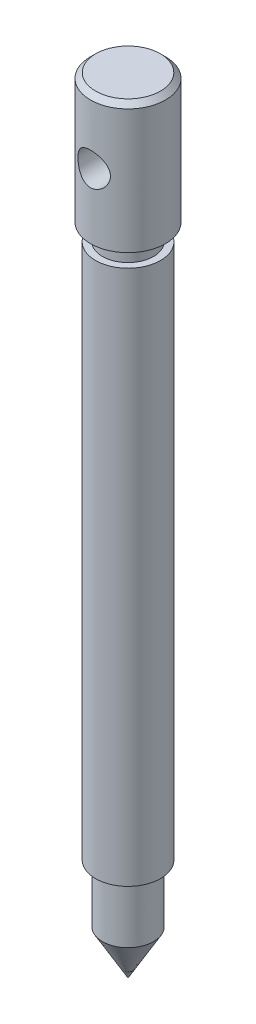
ISO-10303-21;
HEADER;
FILE_DESCRIPTION(('STEP AP214'),'2;1');
FILE_NAME('part.step','',(''),(''),'','','');
FILE_SCHEMA(('AUTOMOTIVE_DESIGN { 1 0 10303 214 1 1 1 1 }'));
ENDSEC;
DATA;
#1=APPLICATION_CONTEXT('core data for automotive mechanical design processes');
#2=APPLICATION_PROTOCOL_DEFINITION('international standard','automotive_design',2000,#1);
#3=PRODUCT_CONTEXT('',#1,'mechanical');
#4=PRODUCT('Part','Part','',(#3));
#5=PRODUCT_RELATED_PRODUCT_CATEGORY('part','',(#4));
#6=PRODUCT_DEFINITION_FORMATION('','',#4);
#7=PRODUCT_DEFINITION_CONTEXT('part definition',#1,'design');
#8=PRODUCT_DEFINITION('design','',#6,#7);
#9=PRODUCT_DEFINITION_SHAPE('','',#8);
#10=(LENGTH_UNIT() NAMED_UNIT(*) SI_UNIT(.MILLI.,.METRE.));
#11=(NAMED_UNIT(*) PLANE_ANGLE_UNIT() SI_UNIT($,.RADIAN.));
#12=(NAMED_UNIT(*) SI_UNIT($,.STERADIAN.) SOLID_ANGLE_UNIT());
#13=UNCERTAINTY_MEASURE_WITH_UNIT(LENGTH_MEASURE(1.E-05),#10,'distance_accuracy_value','');
#14=(GEOMETRIC_REPRESENTATION_CONTEXT(3) GLOBAL_UNCERTAINTY_ASSIGNED_CONTEXT((#13)) GLOBAL_UNIT_ASSIGNED_CONTEXT((#10,
#11,#12)) REPRESENTATION_CONTEXT('',''));
#15=CARTESIAN_POINT('',(0.,0.,0.));
#16=DIRECTION('',(0.,0.,1.));
#17=DIRECTION('',(1.,0.,0.));
#18=AXIS2_PLACEMENT_3D('',#15,#16,#17);
#19=CARTESIAN_POINT('',(0.,0.,0.));
#20=DIRECTION('',(0.,1.,0.));
#21=DIRECTION('',(0.,0.,1.));
#22=AXIS2_PLACEMENT_3D('',#19,#20,#21);
#23=CONICAL_SURFACE('',#22,0.,0.5235987755983);
#24=CARTESIAN_POINT('',(0.,12.9903810567665,0.));
#25=DIRECTION('',(0.,-1.,0.));
#26=DIRECTION('',(0.,0.,-1.));
#27=AXIS2_PLACEMENT_3D('',#24,#25,#26);
#28=CIRCLE('',#27,7.5);
#29=CARTESIAN_POINT('',(0.,12.9903810567665,-7.5));
#30=VERTEX_POINT('',#29);
#31=EDGE_CURVE('E116',#30,#30,#28,.T.);
#32=ORIENTED_EDGE('',*,*,#31,.T.);
#33=EDGE_LOOP('',(#32));
#34=FACE_BOUND('',#33,.T.);
#35=CARTESIAN_POINT('',(0.,0.,0.));
#36=VERTEX_POINT('',#35);
#37=VERTEX_LOOP('',#36);
#38=FACE_BOUND('',#37,.T.);
#39=ADVANCED_FACE('F40',(#34,#38),#23,.T.);
#40=CARTESIAN_POINT('',(0.,0.,0.));
#41=DIRECTION('',(0.,-1.,0.));
#42=DIRECTION('',(0.,0.,-1.));
#43=AXIS2_PLACEMENT_3D('',#40,#41,#42);
#44=CYLINDRICAL_SURFACE('',#43,7.5);
#45=CARTESIAN_POINT('',(0.,30.,0.));
#46=DIRECTION('',(0.,-1.,0.));
#47=DIRECTION('',(0.,0.,-1.));
#48=AXIS2_PLACEMENT_3D('',#45,#46,#47);
#49=CIRCLE('',#48,7.5);
#50=CARTESIAN_POINT('',(0.,30.,-7.5));
#51=VERTEX_POINT('',#50);
#52=EDGE_CURVE('E117',#51,#51,#49,.T.);
#53=ORIENTED_EDGE('',*,*,#52,.T.);
#54=EDGE_LOOP('',(#53));
#55=FACE_BOUND('',#54,.T.);
#56=ORIENTED_EDGE('',*,*,#31,.F.);
#57=EDGE_LOOP('',(#56));
#58=FACE_BOUND('',#57,.T.);
#59=ADVANCED_FACE('F51',(#55,#58),#44,.T.);
#60=CARTESIAN_POINT('',(7.5,30.,0.));
#61=DIRECTION('',(0.,-1.,0.));
#62=DIRECTION('',(0.,0.,-1.));
#63=AXIS2_PLACEMENT_3D('',#60,#61,#62);
#64=PLANE('',#63);
#65=CARTESIAN_POINT('',(0.,30.,0.));
#66=DIRECTION('',(0.,-1.,0.));
#67=DIRECTION('',(0.,0.,-1.));
#68=AXIS2_PLACEMENT_3D('',#65,#66,#67);
#69=CIRCLE('',#68,9.525);
#70=CARTESIAN_POINT('',(0.,30.,-9.525));
#71=VERTEX_POINT('',#70);
#72=EDGE_CURVE('E120',#71,#71,#69,.T.);
#73=ORIENTED_EDGE('',*,*,#72,.T.);
#74=EDGE_LOOP('',(#73));
#75=FACE_BOUND('',#74,.T.);
#76=ORIENTED_EDGE('',*,*,#52,.F.);
#77=EDGE_LOOP('',(#76));
#78=FACE_BOUND('',#77,.T.);
#79=ADVANCED_FACE('F56',(#75,#78),#64,.T.);
#80=CARTESIAN_POINT('',(0.,0.,0.));
#81=DIRECTION('',(0.,-1.,0.));
#82=DIRECTION('',(0.,0.,-1.));
#83=AXIS2_PLACEMENT_3D('',#80,#81,#82);
#84=CYLINDRICAL_SURFACE('',#83,9.525);
#85=CARTESIAN_POINT('',(0.,187.,0.));
#86=DIRECTION('',(0.,-1.,0.));
#87=DIRECTION('',(0.,0.,-1.));
#88=AXIS2_PLACEMENT_3D('',#85,#86,#87);
#89=CIRCLE('',#88,9.525);
#90=CARTESIAN_POINT('',(0.,187.,-9.525));
#91=VERTEX_POINT('',#90);
#92=EDGE_CURVE('E125',#91,#91,#89,.T.);
#93=ORIENTED_EDGE('',*,*,#92,.T.);
#94=EDGE_LOOP('',(#93));
#95=FACE_BOUND('',#94,.T.);
#96=ORIENTED_EDGE('',*,*,#72,.F.);
#97=EDGE_LOOP('',(#96));
#98=FACE_BOUND('',#97,.T.);
#99=ADVANCED_FACE('F63',(#95,#98),#84,.T.);
#100=CARTESIAN_POINT('',(9.525,187.,0.));
#101=DIRECTION('',(0.,1.,0.));
#102=DIRECTION('',(0.,0.,1.));
#103=AXIS2_PLACEMENT_3D('',#100,#101,#102);
#104=PLANE('',#103);
#105=CARTESIAN_POINT('',(0.,187.,0.));
#106=DIRECTION('',(0.,-1.,0.));
#107=DIRECTION('',(0.,0.,-1.));
#108=AXIS2_PLACEMENT_3D('',#105,#106,#107);
#109=CIRCLE('',#108,7.5);
#110=CARTESIAN_POINT('',(0.,187.,-7.5));
#111=VERTEX_POINT('',#110);
#112=EDGE_CURVE('E128',#111,#111,#109,.T.);
#113=ORIENTED_EDGE('',*,*,#112,.T.);
#114=EDGE_LOOP('',(#113));
#115=FACE_BOUND('',#114,.T.);
#116=ORIENTED_EDGE('',*,*,#92,.F.);
#117=EDGE_LOOP('',(#116));
#118=FACE_BOUND('',#117,.T.);
#119=ADVANCED_FACE('F67',(#115,#118),#104,.T.);
#120=CARTESIAN_POINT('',(0.,0.,0.));
#121=DIRECTION('',(0.,-1.,0.));
#122=DIRECTION('',(0.,0.,-1.));
#123=AXIS2_PLACEMENT_3D('',#120,#121,#122);
#124=CYLINDRICAL_SURFACE('',#123,7.5);
#125=CARTESIAN_POINT('',(0.,192.,0.));
#126=DIRECTION('',(0.,-1.,0.));
#127=DIRECTION('',(0.,0.,-1.));
#128=AXIS2_PLACEMENT_3D('',#125,#126,#127);
#129=CIRCLE('',#128,7.5);
#130=CARTESIAN_POINT('',(0.,192.,-7.5));
#131=VERTEX_POINT('',#130);
#132=EDGE_CURVE('E131',#131,#131,#129,.T.);
#133=ORIENTED_EDGE('',*,*,#132,.T.);
#134=EDGE_LOOP('',(#133));
#135=FACE_BOUND('',#134,.T.);
#136=ORIENTED_EDGE('',*,*,#112,.F.);
#137=EDGE_LOOP('',(#136));
#138=FACE_BOUND('',#137,.T.);
#139=ADVANCED_FACE('F71',(#135,#138),#124,.T.);
#140=CARTESIAN_POINT('',(7.5,192.,0.));
#141=DIRECTION('',(0.,-1.,0.));
#142=DIRECTION('',(0.,0.,-1.));
#143=AXIS2_PLACEMENT_3D('',#140,#141,#142);
#144=PLANE('',#143);
#145=CARTESIAN_POINT('',(0.,192.,0.));
#146=DIRECTION('',(0.,-1.,0.));
#147=DIRECTION('',(0.,0.,-1.));
#148=AXIS2_PLACEMENT_3D('',#145,#146,#147);
#149=CIRCLE('',#148,11.);
#150=CARTESIAN_POINT('',(0.,192.,-11.));
#151=VERTEX_POINT('',#150);
#152=EDGE_CURVE('E134',#151,#151,#149,.T.);
#153=ORIENTED_EDGE('',*,*,#152,.T.);
#154=EDGE_LOOP('',(#153));
#155=FACE_BOUND('',#154,.T.);
#156=ORIENTED_EDGE('',*,*,#132,.F.);
#157=EDGE_LOOP('',(#156));
#158=FACE_BOUND('',#157,.T.);
#159=ADVANCED_FACE('F75',(#155,#158),#144,.T.);
#160=CARTESIAN_POINT('',(0.,0.,0.));
#161=DIRECTION('',(0.,-1.,0.));
#162=DIRECTION('',(0.,0.,-1.));
#163=AXIS2_PLACEMENT_3D('',#160,#161,#162);
#164=CYLINDRICAL_SURFACE('',#163,11.);
#165=CARTESIAN_POINT('',(0.,228.5,0.));
#166=DIRECTION('',(0.,1.,0.));
#167=DIRECTION('',(0.,0.,1.));
#168=AXIS2_PLACEMENT_3D('',#165,#166,#167);
#169=CIRCLE('',#168,11.);
#170=CARTESIAN_POINT('',(0.,228.5,11.));
#171=VERTEX_POINT('',#170);
#172=EDGE_CURVE('E47',#171,#171,#169,.F.);
#173=ORIENTED_EDGE('',*,*,#172,.T.);
#174=EDGE_LOOP('',(#173));
#175=FACE_BOUND('',#174,.T.);
#176=CARTESIAN_POINT('',(0.,215.7625,-11.));
#177=CARTESIAN_POINT('',(0.127169608569886,215.76249906358,-10.9999992315258));
#178=CARTESIAN_POINT('',(0.254376099032909,215.757399640568,-10.9977887979623));
#179=CARTESIAN_POINT('',(0.507877519838304,215.737051077353,-10.9890019964665));
#180=CARTESIAN_POINT('',(0.634171860265323,215.721795875995,-10.9824230213147));
#181=CARTESIAN_POINT('',(0.885103951344808,215.68125820564,-10.9650552186148));
#182=CARTESIAN_POINT('',(1.00973798351956,215.655956204877,-10.9542581915066));
#183=CARTESIAN_POINT('',(1.25625104019601,215.595579816268,-10.9287327775452));
#184=CARTESIAN_POINT('',(1.37812891647932,215.5605014338,-10.9140027837875));
#185=CARTESIAN_POINT('',(1.6177993403371,215.481071392477,-10.8810520259155));
#186=CARTESIAN_POINT('',(1.73560608359136,215.436756788804,-10.8628452342524));
#187=CARTESIAN_POINT('',(1.9669295951166,215.339167924001,-10.8233538234563));
#188=CARTESIAN_POINT('',(2.08044473804369,215.285890309156,-10.8020680526726));
#189=CARTESIAN_POINT('',(2.41339731451278,215.1133055029,-10.7343665482442));
#190=CARTESIAN_POINT('',(2.62555202215799,214.981142674763,-10.6840619916617));
#191=CARTESIAN_POINT('',(3.03538555572489,214.679116500169,-10.5751454503608));
#192=CARTESIAN_POINT('',(3.23185415570827,214.507729115361,-10.5162479987283));
#193=CARTESIAN_POINT('',(3.59441438843805,214.135137936174,-10.3979112663786));
#194=CARTESIAN_POINT('',(3.76048882190558,213.933917375819,-10.3384716987399));
#195=CARTESIAN_POINT('',(3.98773192471391,213.607360031775,-10.2520765225787));
#196=CARTESIAN_POINT('',(4.06139965464039,213.491073806929,-10.2230387460115));
#197=CARTESIAN_POINT('',(4.19860595213083,213.252124733832,-10.1674567699124));
#198=CARTESIAN_POINT('',(4.26214873500453,213.129464567592,-10.1409115345635));
#199=CARTESIAN_POINT('',(4.37855231030782,212.878516276464,-10.0911987226593));
#200=CARTESIAN_POINT('',(4.43141288364232,212.750228036208,-10.0680312153849));
#201=CARTESIAN_POINT('',(4.52588798261691,212.488967265612,-10.0259171570631));
#202=CARTESIAN_POINT('',(4.56750844356246,212.355997249567,-10.006968379261));
#203=CARTESIAN_POINT('',(4.63724136886323,212.093136288234,-9.97483796269579));
#204=CARTESIAN_POINT('',(4.66592847277802,211.963427434568,-9.96141397564219));
#205=CARTESIAN_POINT('',(4.71239388300809,211.701713639886,-9.93951740448613));
#206=CARTESIAN_POINT('',(4.73017735239497,211.569709816078,-9.93104247700348));
#207=CARTESIAN_POINT('',(4.75462155816268,211.304483885469,-9.91936279910202));
#208=CARTESIAN_POINT('',(4.76128573347991,211.171262168154,-9.91615641924989));
#209=CARTESIAN_POINT('',(4.76341126030826,210.904712675175,-9.91513570160027));
#210=CARTESIAN_POINT('',(4.75887327481019,210.771384906253,-9.91732104469803));
#211=CARTESIAN_POINT('',(4.73951259242362,210.516985738606,-9.92658652977835));
#212=CARTESIAN_POINT('',(4.7255894914725,210.395828940204,-9.93323834547099));
#213=CARTESIAN_POINT('',(4.68855464390079,210.155200666476,-9.95077257291799));
#214=CARTESIAN_POINT('',(4.66543991329525,210.035729751513,-9.96165635852017));
#215=CARTESIAN_POINT('',(4.61026155033725,209.799325131379,-9.98731259624197));
#216=CARTESIAN_POINT('',(4.57819982754518,209.682390890538,-10.0020842185408));
#217=CARTESIAN_POINT('',(4.50543088174325,209.4517273684,-10.0350725941026));
#218=CARTESIAN_POINT('',(4.46472031412644,209.337999346312,-10.053290679853));
#219=CARTESIAN_POINT('',(4.32816308811113,208.997781256512,-10.1132126623459));
#220=CARTESIAN_POINT('',(4.21906570317983,208.777270793995,-10.1596087144542));
#221=CARTESIAN_POINT('',(3.96930021580578,208.356900532365,-10.2597610976456));
#222=CARTESIAN_POINT('',(3.82861914414851,208.157049265917,-10.3135204487752));
#223=CARTESIAN_POINT('',(3.50451218310632,207.764191982272,-10.4283553388267));
#224=CARTESIAN_POINT('',(3.31834550544064,207.573504657207,-10.4896491019545));
#225=CARTESIAN_POINT('',(2.91597767577435,207.225187168127,-10.6085312555589));
#226=CARTESIAN_POINT('',(2.69976836118786,207.067566017503,-10.6661186327673));
#227=CARTESIAN_POINT('',(2.35378132088765,206.857531224599,-10.745898239449));
#228=CARTESIAN_POINT('',(2.23306896826151,206.79121751829,-10.7716900453297));
#229=CARTESIAN_POINT('',(1.98583652535034,206.66908333842,-10.8199943833085));
#230=CARTESIAN_POINT('',(1.85931883864791,206.613258570037,-10.8425082567418));
#231=CARTESIAN_POINT('',(1.60138370060539,206.512668918535,-10.8835944302055));
#232=CARTESIAN_POINT('',(1.46996754890906,206.46790112552,-10.9021677670965));
#233=CARTESIAN_POINT('',(1.20320977582517,206.389902858659,-10.9348220206971));
#234=CARTESIAN_POINT('',(1.06786848081681,206.356671428518,-10.9489033097628));
#235=CARTESIAN_POINT('',(0.803581231435723,206.303982324917,-10.9713558192959));
#236=CARTESIAN_POINT('',(0.674816626566859,206.283749172739,-10.9800471470545));
#237=CARTESIAN_POINT('',(0.415841013177591,206.253899591273,-10.9929013558986));
#238=CARTESIAN_POINT('',(0.285630092490738,206.244282520802,-10.9970645104739));
#239=CARTESIAN_POINT('',(0.0248272915592043,206.235778340005,-11.0007448398786));
#240=CARTESIAN_POINT('',(-0.105764478696193,206.236888389513,-11.0002632444747));
#241=CARTESIAN_POINT('',(-0.366312844548624,206.249817333486,-10.9946712405559));
#242=CARTESIAN_POINT('',(-0.496269456325476,206.261635953719,-10.9895609505752));
#243=CARTESIAN_POINT('',(-0.747450880927748,206.294909375211,-10.9752566106535));
#244=CARTESIAN_POINT('',(-0.868764102233973,206.315800960967,-10.9663015531487));
#245=CARTESIAN_POINT('',(-1.10910083512388,206.366813391515,-10.9446101191729));
#246=CARTESIAN_POINT('',(-1.22812359143713,206.396937226999,-10.9318725174273));
#247=CARTESIAN_POINT('',(-1.58051121486539,206.500752941166,-10.8884240877717));
#248=CARTESIAN_POINT('',(-1.80941741851065,206.587918913178,-10.8524641912048));
#249=CARTESIAN_POINT('',(-2.25638154321797,206.798430944382,-10.7685750393689));
#250=CARTESIAN_POINT('',(-2.47387695984791,206.922822452553,-10.7203068763558));
#251=CARTESIAN_POINT('',(-2.88572938264203,207.203154125147,-10.6168583495153));
#252=CARTESIAN_POINT('',(-3.08007638864383,207.359107846553,-10.5616750192937));
#253=CARTESIAN_POINT('',(-3.45577228054621,207.71206266743,-10.4450595716121));
#254=CARTESIAN_POINT('',(-3.63497567959804,207.91129672231,-10.38347307997));
#255=CARTESIAN_POINT('',(-3.95813548813751,208.338026123447,-10.2646421582828));
#256=CARTESIAN_POINT('',(-4.102081386693,208.565529867043,-10.2073990265779));
#257=CARTESIAN_POINT('',(-4.28946432031643,208.92616085623,-10.129422227521));
#258=CARTESIAN_POINT('',(-4.34760266803679,209.050951378511,-10.1045365350345));
#259=CARTESIAN_POINT('',(-4.45304833016758,209.305675591902,-10.0585123913928));
#260=CARTESIAN_POINT('',(-4.50036039876639,209.435606995962,-10.0373722963421));
#261=CARTESIAN_POINT('',(-4.58362110322574,209.699623367584,-9.99962548445617));
#262=CARTESIAN_POINT('',(-4.61957578853797,209.83370608204,-9.98301635487078));
#263=CARTESIAN_POINT('',(-4.67971248184046,210.105016967582,-9.95496843968551));
#264=CARTESIAN_POINT('',(-4.70389572486276,210.242244807106,-9.94352911169122));
#265=CARTESIAN_POINT('',(-4.73867912924932,210.507341644231,-9.92699638023366));
#266=CARTESIAN_POINT('',(-4.7502274956547,210.635059430707,-9.92146092316295));
#267=CARTESIAN_POINT('',(-4.76298043516609,210.891126401806,-9.91534514228228));
#268=CARTESIAN_POINT('',(-4.76418560753702,211.01947554942,-9.914764531398));
#269=CARTESIAN_POINT('',(-4.7562378994933,211.275755287343,-9.91857951964499));
#270=CARTESIAN_POINT('',(-4.747086721891,211.403685942994,-9.92297430071211));
#271=CARTESIAN_POINT('',(-4.71854371880235,211.658135774711,-9.93657857350089));
#272=CARTESIAN_POINT('',(-4.69915201806896,211.784654967954,-9.94578800656908));
#273=CARTESIAN_POINT('',(-4.65168599467941,212.028492079204,-9.96807226381834));
#274=CARTESIAN_POINT('',(-4.62414281290255,212.145935528524,-9.980908916619));
#275=CARTESIAN_POINT('',(-4.56037765864665,212.377991712753,-10.0102037013579));
#276=CARTESIAN_POINT('',(-4.5241528986952,212.492603525419,-10.0266629963116));
#277=CARTESIAN_POINT('',(-4.4029195141831,212.831139495542,-10.0807832115285));
#278=CARTESIAN_POINT('',(-4.30531894674098,213.0499307061,-10.1232027233425));
#279=CARTESIAN_POINT('',(-4.07240934131555,213.482124603703,-10.2192090386332));
#280=CARTESIAN_POINT('',(-3.93512244119893,213.694332855319,-10.2733286332994));
#281=CARTESIAN_POINT('',(-3.62939952395762,214.093899386246,-10.3852775021215));
#282=CARTESIAN_POINT('',(-3.46095138034861,214.281247942428,-10.4431082147276));
#283=CARTESIAN_POINT('',(-3.08131784371245,214.641521366636,-10.5616275712393));
#284=CARTESIAN_POINT('',(-2.86777252134213,214.812038833894,-10.6221668409421));
#285=CARTESIAN_POINT('',(-2.5269588552426,215.039135771681,-10.7064602814345));
#286=CARTESIAN_POINT('',(-2.40983395952608,215.110101232699,-10.7334916549212));
#287=CARTESIAN_POINT('',(-2.16943232027393,215.241901243757,-10.7846476785177));
#288=CARTESIAN_POINT('',(-2.04615845217077,215.302740472441,-10.808773669575));
#289=CARTESIAN_POINT('',(-1.79593191221221,215.412990692063,-10.8531363171421));
#290=CARTESIAN_POINT('',(-1.66904945502341,215.462542183187,-10.8734201912986));
#291=CARTESIAN_POINT('',(-1.41102748206951,215.550712005617,-10.9099020088076));
#292=CARTESIAN_POINT('',(-1.27989003699256,215.589335568618,-10.9261019069378));
#293=CARTESIAN_POINT('',(-1.01464903505411,215.65516093143,-10.9539138731095));
#294=CARTESIAN_POINT('',(-0.880553512995684,215.682390422564,-10.9655370599484));
#295=CARTESIAN_POINT('',(-0.61025480328946,215.725219028798,-10.9838932423328));
#296=CARTESIAN_POINT('',(-0.47405318503904,215.740826414756,-10.9906297154147));
#297=CARTESIAN_POINT('',(-0.281275816418197,215.754520096025,-10.9965470285504));
#298=CARTESIAN_POINT('',(-0.225073005203623,215.757511554191,-10.9978410115761));
#299=CARTESIAN_POINT('',(-0.112582538899644,215.761501721014,-10.9995676706652));
#300=CARTESIAN_POINT('',(-0.0562948831688689,215.76250041453,-11.0000003401848));
#301=CARTESIAN_POINT('',(0.,215.7625,-11.));
#302=B_SPLINE_CURVE_WITH_KNOTS('',3,(#176,#177,#178,#179,#180,#181,#182,#183,#184,#185,#186,
#187,#188,#189,#190,#191,#192,#193,#194,#195,#196,#197,#198,#199,#200,#201,#202,#203,#204,#205,
#206,#207,#208,#209,#210,#211,#212,#213,#214,#215,#216,#217,#218,#219,#220,#221,#222,#223,#224,
#225,#226,#227,#228,#229,#230,#231,#232,#233,#234,#235,#236,#237,#238,#239,#240,#241,#242,#243,
#244,#245,#246,#247,#248,#249,#250,#251,#252,#253,#254,#255,#256,#257,#258,#259,#260,#261,#262,
#263,#264,#265,#266,#267,#268,#269,#270,#271,#272,#273,#274,#275,#276,#277,#278,#279,#280,#281,
#282,#283,#284,#285,#286,#287,#288,#289,#290,#291,#292,#293,#294,#295,#296,#297,#298,#299,#300,
#301),.UNSPECIFIED.,.T.,.F.,(4,2,2,2,2,2,2,2,2,2,2,2,2,2,2,2,2,2,2,2,2,2,2,2,2,2,2,2,2,2,2,2,2,
2,2,2,2,2,2,2,2,2,2,2,2,2,2,2,2,2,2,2,2,2,2,2,2,2,2,2,2,2,4),(0.,0.381451993312566,
0.763131848480378,1.14555738090914,1.52813940185813,1.90921509408775,2.29043369289587,
3.05189233337129,3.85047918073446,4.6495165400021,5.0711353785212,5.49257822362285,
5.91402971175716,6.3352582166968,6.73527674070891,7.13510570200879,7.53481098266858,
7.93449260766186,8.30046857049714,8.66656344146164,9.03258023632269,9.39873883254178,
10.1464224984416,10.8944137491951,11.7111753916341,12.528159383758,12.948067035673,
13.3678023748536,13.7874271330941,14.2070170986357,14.5984128683592,14.9897849975058,
15.3810535079037,15.7723119987566,16.1421416584263,16.5120912474506,17.2513254118823,
18.0136593034863,18.7763213395722,19.5975722987525,20.4190677912998,20.8383018150984,
21.2573513841204,21.6761773706982,22.0949594055616,22.4795318284046,22.8640819697052,
23.2485688916662,23.6330511298067,23.9965669860954,24.3601997164309,25.086959527732,
25.8592083753607,26.6317583803871,27.4670553922968,27.8853900054282,28.3035307947201,
28.7161415629878,29.1285544602966,29.539959154772,29.9510707929845,30.1199290012518,
30.2887884924428),.UNSPECIFIED.);
#303=CARTESIAN_POINT('',(0.,215.7625,-11.));
#304=VERTEX_POINT('',#303);
#305=EDGE_CURVE('E95',#304,#304,#302,.T.);
#306=ORIENTED_EDGE('',*,*,#305,.F.);
#307=EDGE_LOOP('',(#306));
#308=FACE_BOUND('',#307,.T.);
#309=CARTESIAN_POINT('',(4.7625,211.,9.91557329406626));
#310=CARTESIAN_POINT('',(4.76249902410094,211.126539320261,9.91557435345229));
#311=CARTESIAN_POINT('',(4.75744952467893,211.253117634035,9.91800397108076));
#312=CARTESIAN_POINT('',(4.73730484479164,211.505344282799,9.92764138162707));
#313=CARTESIAN_POINT('',(4.72220344162109,211.630991992944,9.9348521343312));
#314=CARTESIAN_POINT('',(4.68208700456845,211.880611876832,9.953821054238));
#315=CARTESIAN_POINT('',(4.65705181419024,212.004580110577,9.96558846611061));
#316=CARTESIAN_POINT('',(4.59733385265195,212.24974261166,9.99327788277881));
#317=CARTESIAN_POINT('',(4.56264700161107,212.370935682402,10.00920164434));
#318=CARTESIAN_POINT('',(4.48416064598052,212.609147670442,10.0446077558123));
#319=CARTESIAN_POINT('',(4.44040527614035,212.726183702001,10.0640728168151));
#320=CARTESIAN_POINT('',(4.34406978483923,212.956019839146,10.1060287670711));
#321=CARTESIAN_POINT('',(4.29148634790275,213.06881833373,10.1285207925014));
#322=CARTESIAN_POINT('',(4.12115026636219,213.399787624707,10.1995711578437));
#323=CARTESIAN_POINT('',(3.99071684936783,213.610818040526,10.2517487333394));
#324=CARTESIAN_POINT('',(3.69060949420535,214.021507633518,10.3637142299029));
#325=CARTESIAN_POINT('',(3.51902553880382,214.219685232665,10.4237723191308));
#326=CARTESIAN_POINT('',(3.14527813203637,214.585656896107,10.5425591787687));
#327=CARTESIAN_POINT('',(2.94310238997162,214.75343868864,10.6012874039341));
#328=CARTESIAN_POINT('',(2.61528215786563,214.982546937547,10.6852196552555));
#329=CARTESIAN_POINT('',(2.49897555422024,215.056549823639,10.7130827862208));
#330=CARTESIAN_POINT('',(2.25992323732976,215.194420259555,10.7660438794003));
#331=CARTESIAN_POINT('',(2.13718020348916,215.258291982979,10.7911429789663));
#332=CARTESIAN_POINT('',(1.88604340326822,215.375322371128,10.8378577336395));
#333=CARTESIAN_POINT('',(1.75764922629994,215.42848025586,10.8594731351025));
#334=CARTESIAN_POINT('',(1.49620206190936,215.523507054527,10.8985702467671));
#335=CARTESIAN_POINT('',(1.36315148997336,215.565381726311,10.9160540647633));
#336=CARTESIAN_POINT('',(1.10084698144195,215.635400618558,10.9455279314901));
#337=CARTESIAN_POINT('',(0.971789341643374,215.664175551036,10.9577681129929));
#338=CARTESIAN_POINT('',(0.711441991018879,215.710916837131,10.977744926092));
#339=CARTESIAN_POINT('',(0.580153319236584,215.7288880877,10.9854835980224));
#340=CARTESIAN_POINT('',(0.316363659289761,215.753826835169,10.9962419328216));
#341=CARTESIAN_POINT('',(0.183862873326452,215.760796134888,10.9992623688369));
#342=CARTESIAN_POINT('',(-0.081277852896825,215.763651424616,11.0004984551766));
#343=CARTESIAN_POINT('',(-0.213917787001559,215.759537885788,10.9987143097579));
#344=CARTESIAN_POINT('',(-0.469525017134543,215.740915092069,10.9906690625248));
#345=CARTESIAN_POINT('',(-0.592553802267043,215.727108649898,10.9847106846447));
#346=CARTESIAN_POINT('',(-0.836950192513668,215.690011044125,10.9687974252648));
#347=CARTESIAN_POINT('',(-0.958317237131794,215.666716758003,10.9588412280683));
#348=CARTESIAN_POINT('',(-1.19849189906394,215.610879878869,10.9351802015835));
#349=CARTESIAN_POINT('',(-1.31730035390782,215.578340363263,10.9214766197223));
#350=CARTESIAN_POINT('',(-1.55165879856586,215.504318850832,10.8906547160191));
#351=CARTESIAN_POINT('',(-1.66720752416943,215.46283343703,10.8735350895709));
#352=CARTESIAN_POINT('',(-2.01127945492698,215.324095930179,10.8170750306245));
#353=CARTESIAN_POINT('',(-2.23376548049775,215.213372196837,10.7729901179197));
#354=CARTESIAN_POINT('',(-2.65746715338967,214.959844331373,10.6763885083964));
#355=CARTESIAN_POINT('',(-2.85867508337401,214.817028618121,10.623868769633));
#356=CARTESIAN_POINT('',(-3.25034853448632,214.490898311749,10.5109377029407));
#357=CARTESIAN_POINT('',(-3.43886677912027,214.305345085731,10.4502299291002));
#358=CARTESIAN_POINT('',(-3.78304965820769,213.905093540102,10.3306247952725));
#359=CARTESIAN_POINT('',(-3.93869953001086,213.690382195118,10.2717282588963));
#360=CARTESIAN_POINT('',(-4.14695280112259,213.345884089609,10.1886538632467));
#361=CARTESIAN_POINT('',(-4.21313588362965,213.224857583705,10.1613906289072));
#362=CARTESIAN_POINT('',(-4.33496729071239,212.97699404895,10.110016133467));
#363=CARTESIAN_POINT('',(-4.39062024022358,212.850159601547,10.0859034900433));
#364=CARTESIAN_POINT('',(-4.49084094639751,212.591536519432,10.0416807462424));
#365=CARTESIAN_POINT('',(-4.53541068920739,212.459748777245,10.0215699288542));
#366=CARTESIAN_POINT('',(-4.61295343586132,212.192242709976,9.98611444091217));
#367=CARTESIAN_POINT('',(-4.64593273406919,212.056526561752,9.97076718396658));
#368=CARTESIAN_POINT('',(-4.69806356408226,211.79156653332,9.94630432260826));
#369=CARTESIAN_POINT('',(-4.71800271906787,211.66250987405,9.93683600635827));
#370=CARTESIAN_POINT('',(-4.74721543264492,211.402980785987,9.92291337136958));
#371=CARTESIAN_POINT('',(-4.75649393239885,211.27250904141,9.91845672976412));
#372=CARTESIAN_POINT('',(-4.76428025719186,211.011187682357,9.91471898242994));
#373=CARTESIAN_POINT('',(-4.76278950971934,210.88033812026,9.91543719076296));
#374=CARTESIAN_POINT('',(-4.74906114130528,210.619339790934,9.92201973288228));
#375=CARTESIAN_POINT('',(-4.73682389841956,210.489190999215,9.92788388563709));
#376=CARTESIAN_POINT('',(-4.70301797529446,210.239943688648,9.9439400790021));
#377=CARTESIAN_POINT('',(-4.68218293631225,210.120723093275,9.95379088592687));
#378=CARTESIAN_POINT('',(-4.6316115956375,209.884569802929,9.97742160636322));
#379=CARTESIAN_POINT('',(-4.60187239786436,209.767637865545,9.99120279816445));
#380=CARTESIAN_POINT('',(-4.49970114780462,209.421430342457,10.0378470547303));
#381=CARTESIAN_POINT('',(-4.4142898595032,209.196557633001,10.0760237269046));
#382=CARTESIAN_POINT('',(-4.20725044188695,208.754394669626,10.1642593438768));
#383=CARTESIAN_POINT('',(-4.08419821280322,208.537869507748,10.2147659853286));
#384=CARTESIAN_POINT('',(-3.80670877412704,208.127412887442,10.3213871815946));
#385=CARTESIAN_POINT('',(-3.65225725864664,207.933491791287,10.3775042866588));
#386=CARTESIAN_POINT('',(-3.30019308814519,207.555782348124,10.4950538382274));
#387=CARTESIAN_POINT('',(-3.09995903338782,207.374441780832,10.556513806875));
#388=CARTESIAN_POINT('',(-2.67037533714177,207.047374649055,10.673258712264));
#389=CARTESIAN_POINT('',(-2.44102247095706,206.901652034235,10.7285429638131));
#390=CARTESIAN_POINT('',(-2.07887963624506,206.712993312594,10.8024852038038));
#391=CARTESIAN_POINT('',(-1.95467873257693,206.654944277893,10.8257006870954));
#392=CARTESIAN_POINT('',(-1.70120148450632,206.549592979028,10.8684123363809));
#393=CARTESIAN_POINT('',(-1.57192737508267,206.50228604345,10.8879101184969));
#394=CARTESIAN_POINT('',(-1.30928457015571,206.418934152554,10.9226061009736));
#395=CARTESIAN_POINT('',(-1.17591714592354,206.382885738753,10.9378056215733));
#396=CARTESIAN_POINT('',(-0.906117033556481,206.32245134769,10.9634531020064));
#397=CARTESIAN_POINT('',(-0.769684599556898,206.298064407227,10.9739014542682));
#398=CARTESIAN_POINT('',(-0.505187855053051,206.262633095767,10.989131229423));
#399=CARTESIAN_POINT('',(-0.377259043233948,206.25072868796,10.9942774271301));
#400=CARTESIAN_POINT('',(-0.12070901605687,206.237297131441,11.0000861192807));
#401=CARTESIAN_POINT('',(0.00791241698223669,206.235773461863,11.000747110494));
#402=CARTESIAN_POINT('',(0.264727509669817,206.243129307504,10.9975634490732));
#403=CARTESIAN_POINT('',(0.392921369410818,206.25200296529,10.9937213333069));
#404=CARTESIAN_POINT('',(0.648013996687758,206.28004696264,10.9816388131798));
#405=CARTESIAN_POINT('',(0.774912264902326,206.299221129914,10.9733967737972));
#406=CARTESIAN_POINT('',(1.02126321679408,206.346667124096,10.9531574657719));
#407=CARTESIAN_POINT('',(1.14080784818128,206.3745336962,10.9413280242812));
#408=CARTESIAN_POINT('',(1.37703290509117,206.439275419881,10.9141170172499));
#409=CARTESIAN_POINT('',(1.49371231981417,206.476153701785,10.8987342175093));
#410=CARTESIAN_POINT('',(1.83829353104192,206.599826570022,10.847783051539));
#411=CARTESIAN_POINT('',(2.06094107658258,206.699698721635,10.8073943672216));
#412=CARTESIAN_POINT('',(2.49663070436927,206.936432839582,10.7153529151518));
#413=CARTESIAN_POINT('',(2.7087680450761,207.074777378793,10.6632695343762));
#414=CARTESIAN_POINT('',(3.10775646625234,207.382433504717,10.5538943346921));
#415=CARTESIAN_POINT('',(3.29459728137232,207.551757597808,10.496600417016));
#416=CARTESIAN_POINT('',(3.6522206322077,207.931519271457,10.3778314241552));
#417=CARTESIAN_POINT('',(3.82077741886098,208.144077256455,10.316362094781));
#418=CARTESIAN_POINT('',(4.04523967750721,208.482881554992,10.229492285556));
#419=CARTESIAN_POINT('',(4.11538042978959,208.599254581837,10.2014025206546));
#420=CARTESIAN_POINT('',(4.24567217901321,208.838024267591,10.1478677188803));
#421=CARTESIAN_POINT('',(4.30582771375003,208.960418157347,10.1224214826302));
#422=CARTESIAN_POINT('',(4.41563217452261,209.210513754803,10.0750074978232));
#423=CARTESIAN_POINT('',(4.46527865145386,209.338216691481,10.0530405604062));
#424=CARTESIAN_POINT('',(4.55351785593804,209.597972842825,10.013381880147));
#425=CARTESIAN_POINT('',(4.5921160729667,209.730023860592,9.99568801485715));
#426=CARTESIAN_POINT('',(4.65774376705525,209.997154533003,9.9652762137507));
#427=CARTESIAN_POINT('',(4.6848036847746,210.132225216529,9.95254519253904));
#428=CARTESIAN_POINT('',(4.72713215155395,210.404528787997,9.93251110144585));
#429=CARTESIAN_POINT('',(4.74240968762262,210.541759946345,9.92520389471127));
#430=CARTESIAN_POINT('',(4.75529762094146,210.732767403219,9.91902990709743));
#431=CARTESIAN_POINT('',(4.75799755609118,210.786166876701,9.91773476888999));
#432=CARTESIAN_POINT('',(4.76159896885935,210.893041910606,9.91600623034907));
#433=CARTESIAN_POINT('',(4.76250041246901,210.94651747245,9.91557284631103));
#434=CARTESIAN_POINT('',(4.7625,211.,9.91557329406626));
#435=B_SPLINE_CURVE_WITH_KNOTS('',3,(#309,#310,#311,#312,#313,#314,#315,#316,#317,#318,#319,
#320,#321,#322,#323,#324,#325,#326,#327,#328,#329,#330,#331,#332,#333,#334,#335,#336,#337,#338,
#339,#340,#341,#342,#343,#344,#345,#346,#347,#348,#349,#350,#351,#352,#353,#354,#355,#356,#357,
#358,#359,#360,#361,#362,#363,#364,#365,#366,#367,#368,#369,#370,#371,#372,#373,#374,#375,#376,
#377,#378,#379,#380,#381,#382,#383,#384,#385,#386,#387,#388,#389,#390,#391,#392,#393,#394,#395,
#396,#397,#398,#399,#400,#401,#402,#403,#404,#405,#406,#407,#408,#409,#410,#411,#412,#413,#414,
#415,#416,#417,#418,#419,#420,#421,#422,#423,#424,#425,#426,#427,#428,#429,#430,#431,#432,#433,
#434),.UNSPECIFIED.,.T.,.F.,(4,2,2,2,2,2,2,2,2,2,2,2,2,2,2,2,2,2,2,2,2,2,2,2,2,2,2,2,2,2,2,2,2,
2,2,2,2,2,2,2,2,2,2,2,2,2,2,2,2,2,2,2,2,2,2,2,2,2,2,2,2,2,4),(0.,0.37956242302597,
0.759360035776728,1.1399322635488,1.52066560911951,1.89958776882315,2.27865255647144,
3.03587895555933,3.83935098651596,4.64314668548853,5.06462289045479,5.48592501195203,
5.90725779415602,6.32837516028037,6.72622904700515,7.12390246344464,7.52151070890024,
7.91910205112421,8.29049682341421,8.66201392336632,9.03340750315107,9.40494319257503,
10.1586110080731,10.912551240026,11.7232173463336,12.5342467880854,12.9556172777866,
13.3768022657281,13.7979117214518,14.2187921327361,14.6110602736524,15.0031465267318,
15.3951808088333,15.7872012999364,16.1510549891886,16.5150271507691,17.2424153156947,
18.0017050740693,18.7613415523176,19.5887542149704,20.4162585875979,20.8329432971563,
21.2494464546377,21.6658215411647,22.0821622304466,22.4674268116904,22.8528205091232,
23.2379971956949,23.6233171145551,23.9928382311561,24.3624878882897,25.1011725002265,
25.8736340987851,26.6464082292807,27.4766200375465,27.8924528455737,28.3080961573472,
28.7238362271679,29.1393693709768,29.5537993571246,29.9679129234102,30.1283339992563,
30.2887581085746),.UNSPECIFIED.);
#436=CARTESIAN_POINT('',(4.7625,211.,9.91557329406626));
#437=VERTEX_POINT('',#436);
#438=EDGE_CURVE('E89',#437,#437,#435,.T.);
#439=ORIENTED_EDGE('',*,*,#438,.F.);
#440=EDGE_LOOP('',(#439));
#441=FACE_BOUND('',#440,.T.);
#442=ORIENTED_EDGE('',*,*,#152,.F.);
#443=EDGE_LOOP('',(#442));
#444=FACE_BOUND('',#443,.T.);
#445=ADVANCED_FACE('F79',(#175,#308,#441,#444),#164,.T.);
#446=CARTESIAN_POINT('',(11.,230.,0.));
#447=DIRECTION('',(0.,1.,0.));
#448=DIRECTION('',(0.,0.,1.));
#449=AXIS2_PLACEMENT_3D('',#446,#447,#448);
#450=PLANE('',#449);
#451=CARTESIAN_POINT('',(0.,230.,0.));
#452=DIRECTION('',(0.,1.,0.));
#453=DIRECTION('',(0.,0.,1.));
#454=AXIS2_PLACEMENT_3D('',#451,#452,#453);
#455=CIRCLE('',#454,9.49999999999995);
#456=CARTESIAN_POINT('',(0.,230.,9.49999999999995));
#457=VERTEX_POINT('',#456);
#458=EDGE_CURVE('E11',#457,#457,#455,.T.);
#459=ORIENTED_EDGE('',*,*,#458,.T.);
#460=EDGE_LOOP('',(#459));
#461=FACE_BOUND('',#460,.T.);
#462=ADVANCED_FACE('F84',(#461),#450,.T.);
#463=CARTESIAN_POINT('',(0.,211.,-11.));
#464=DIRECTION('',(0.,0.,1.));
#465=DIRECTION('',(1.,0.,0.));
#466=AXIS2_PLACEMENT_3D('',#463,#464,#465);
#467=CYLINDRICAL_SURFACE('',#466,4.7625);
#468=ORIENTED_EDGE('',*,*,#305,.T.);
#469=EDGE_LOOP('',(#468));
#470=FACE_BOUND('',#469,.T.);
#471=ORIENTED_EDGE('',*,*,#438,.T.);
#472=EDGE_LOOP('',(#471));
#473=FACE_BOUND('',#472,.T.);
#474=ADVANCED_FACE('F100',(#470,#473),#467,.F.);
#475=CARTESIAN_POINT('',(0.,228.5,0.));
#476=DIRECTION('',(0.,-1.,0.));
#477=DIRECTION('',(0.,0.,-1.));
#478=AXIS2_PLACEMENT_3D('',#475,#476,#477);
#479=CONICAL_SURFACE('',#478,11.,0.785398163397445);
#480=ORIENTED_EDGE('',*,*,#458,.F.);
#481=EDGE_LOOP('',(#480));
#482=FACE_BOUND('',#481,.T.);
#483=ORIENTED_EDGE('',*,*,#172,.F.);
#484=EDGE_LOOP('',(#483));
#485=FACE_BOUND('',#484,.T.);
#486=ADVANCED_FACE('F42',(#482,#485),#479,.T.);
#487=CLOSED_SHELL('',(#39,#59,#79,#99,#119,#139,#159,#445,#462,#474,#486));
#488=MANIFOLD_SOLID_BREP('B2',#487);
#489=ADVANCED_BREP_SHAPE_REPRESENTATION('',(#18,#488),#14);
#490=SHAPE_DEFINITION_REPRESENTATION(#9,#489);
ENDSEC;
END-ISO-10303-21;
